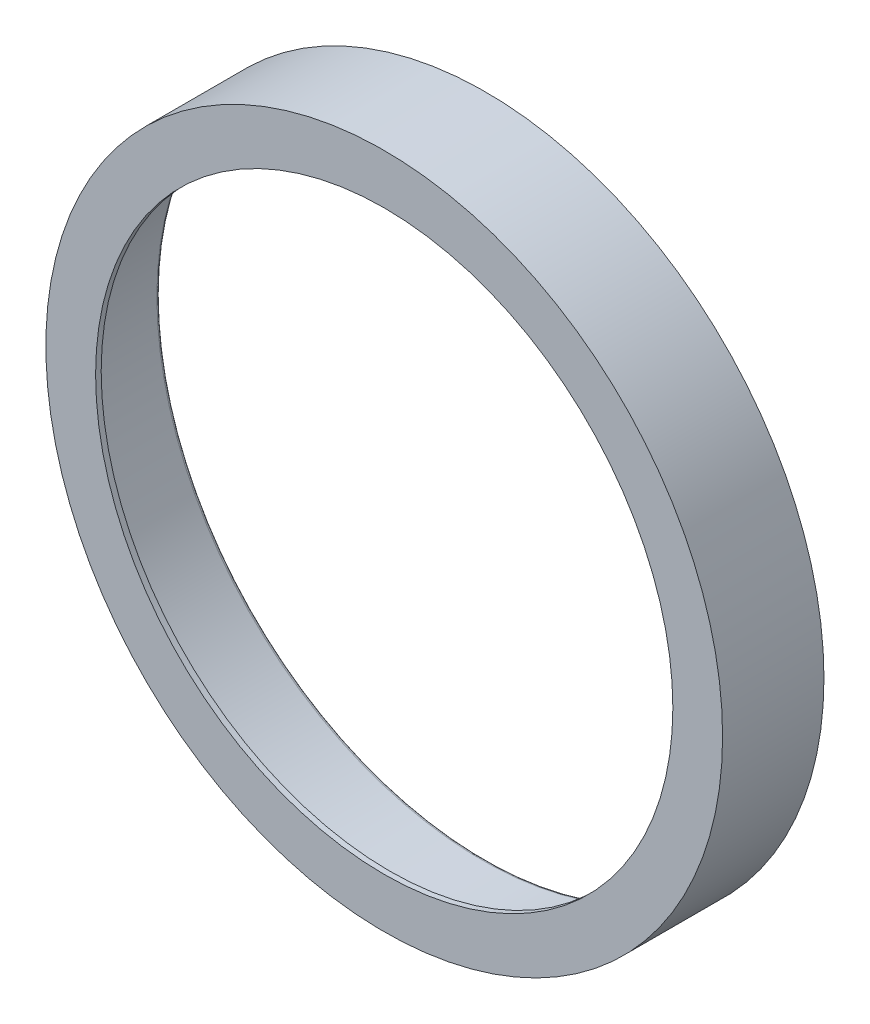
ISO-10303-21;
HEADER;
FILE_DESCRIPTION(('STEP AP214'),'2;1');
FILE_NAME('part.step','',(''),(''),'','','');
FILE_SCHEMA(('AUTOMOTIVE_DESIGN { 1 0 10303 214 1 1 1 1 }'));
ENDSEC;
DATA;
#1=APPLICATION_CONTEXT('core data for automotive mechanical design processes');
#2=APPLICATION_PROTOCOL_DEFINITION('international standard','automotive_design',2000,#1);
#3=PRODUCT_CONTEXT('',#1,'mechanical');
#4=PRODUCT('Part','Part','',(#3));
#5=PRODUCT_RELATED_PRODUCT_CATEGORY('part','',(#4));
#6=PRODUCT_DEFINITION_FORMATION('','',#4);
#7=PRODUCT_DEFINITION_CONTEXT('part definition',#1,'design');
#8=PRODUCT_DEFINITION('design','',#6,#7);
#9=PRODUCT_DEFINITION_SHAPE('','',#8);
#10=(LENGTH_UNIT() NAMED_UNIT(*) SI_UNIT(.MILLI.,.METRE.));
#11=(NAMED_UNIT(*) PLANE_ANGLE_UNIT() SI_UNIT($,.RADIAN.));
#12=(NAMED_UNIT(*) SI_UNIT($,.STERADIAN.) SOLID_ANGLE_UNIT());
#13=UNCERTAINTY_MEASURE_WITH_UNIT(LENGTH_MEASURE(1.E-05),#10,'distance_accuracy_value','');
#14=(GEOMETRIC_REPRESENTATION_CONTEXT(3) GLOBAL_UNCERTAINTY_ASSIGNED_CONTEXT((#13)) GLOBAL_UNIT_ASSIGNED_CONTEXT((#10,
#11,#12)) REPRESENTATION_CONTEXT('',''));
#15=CARTESIAN_POINT('',(0.,0.,0.));
#16=DIRECTION('',(0.,0.,1.));
#17=DIRECTION('',(1.,0.,0.));
#18=AXIS2_PLACEMENT_3D('',#15,#16,#17);
#19=CARTESIAN_POINT('',(0.,0.,31.75));
#20=DIRECTION('',(0.,0.,-1.));
#21=DIRECTION('',(-1.,0.,0.));
#22=AXIS2_PLACEMENT_3D('',#19,#20,#21);
#23=CYLINDRICAL_SURFACE('',#22,90.4143496384652);
#24=CARTESIAN_POINT('',(0.,0.,31.75));
#25=DIRECTION('',(0.,0.,1.));
#26=DIRECTION('',(1.,0.,0.));
#27=AXIS2_PLACEMENT_3D('',#24,#25,#26);
#28=CIRCLE('',#27,90.4143496384652);
#29=CARTESIAN_POINT('',(90.4143496384652,0.,31.75));
#30=VERTEX_POINT('',#29);
#31=EDGE_CURVE('E72',#30,#30,#28,.T.);
#32=ORIENTED_EDGE('',*,*,#31,.T.);
#33=EDGE_LOOP('',(#32));
#34=FACE_BOUND('',#33,.T.);
#35=CARTESIAN_POINT('',(0.,0.,30.));
#36=DIRECTION('',(0.,0.,-1.));
#37=DIRECTION('',(-1.,0.,0.));
#38=AXIS2_PLACEMENT_3D('',#35,#36,#37);
#39=CIRCLE('',#38,90.4143496384652);
#40=CARTESIAN_POINT('',(-90.4143496384652,0.,30.));
#41=VERTEX_POINT('',#40);
#42=EDGE_CURVE('E68',#41,#41,#39,.T.);
#43=ORIENTED_EDGE('',*,*,#42,.T.);
#44=EDGE_LOOP('',(#43));
#45=FACE_BOUND('',#44,.T.);
#46=ADVANCED_FACE('F43',(#34,#45),#23,.F.);
#47=CARTESIAN_POINT('',(0.,0.,31.75));
#48=DIRECTION('',(0.,0.,1.));
#49=DIRECTION('',(1.,0.,0.));
#50=AXIS2_PLACEMENT_3D('',#47,#48,#49);
#51=PLANE('',#50);
#52=CARTESIAN_POINT('',(0.,0.,31.75));
#53=DIRECTION('',(0.,0.,1.));
#54=DIRECTION('',(1.,0.,0.));
#55=AXIS2_PLACEMENT_3D('',#52,#53,#54);
#56=CIRCLE('',#55,106.);
#57=CARTESIAN_POINT('',(106.,0.,31.75));
#58=VERTEX_POINT('',#57);
#59=EDGE_CURVE('E67',#58,#58,#56,.T.);
#60=ORIENTED_EDGE('',*,*,#59,.T.);
#61=EDGE_LOOP('',(#60));
#62=FACE_BOUND('',#61,.T.);
#63=ORIENTED_EDGE('',*,*,#31,.F.);
#64=EDGE_LOOP('',(#63));
#65=FACE_BOUND('',#64,.T.);
#66=ADVANCED_FACE('F86',(#62,#65),#51,.T.);
#67=CARTESIAN_POINT('',(0.,0.,0.));
#68=DIRECTION('',(0.,0.,1.));
#69=DIRECTION('',(1.,0.,0.));
#70=AXIS2_PLACEMENT_3D('',#67,#68,#69);
#71=PLANE('',#70);
#72=CARTESIAN_POINT('',(0.,0.,0.));
#73=DIRECTION('',(0.,0.,1.));
#74=DIRECTION('',(1.,0.,0.));
#75=AXIS2_PLACEMENT_3D('',#72,#73,#74);
#76=CIRCLE('',#75,102.971973165909);
#77=CARTESIAN_POINT('',(102.971973165909,0.,0.));
#78=VERTEX_POINT('',#77);
#79=EDGE_CURVE('E56',#78,#78,#76,.T.);
#80=ORIENTED_EDGE('',*,*,#79,.T.);
#81=EDGE_LOOP('',(#80));
#82=FACE_BOUND('',#81,.T.);
#83=CARTESIAN_POINT('',(0.,0.,0.));
#84=DIRECTION('',(0.,0.,1.));
#85=DIRECTION('',(1.,0.,0.));
#86=AXIS2_PLACEMENT_3D('',#83,#84,#85);
#87=CIRCLE('',#86,106.);
#88=CARTESIAN_POINT('',(106.,0.,0.));
#89=VERTEX_POINT('',#88);
#90=EDGE_CURVE('E73',#89,#89,#87,.T.);
#91=ORIENTED_EDGE('',*,*,#90,.F.);
#92=EDGE_LOOP('',(#91));
#93=FACE_BOUND('',#92,.T.);
#94=ADVANCED_FACE('F88',(#82,#93),#71,.F.);
#95=CARTESIAN_POINT('',(0.,0.,31.75));
#96=DIRECTION('',(0.,0.,-1.));
#97=DIRECTION('',(-1.,0.,0.));
#98=AXIS2_PLACEMENT_3D('',#95,#96,#97);
#99=CYLINDRICAL_SURFACE('',#98,106.);
#100=ORIENTED_EDGE('',*,*,#59,.F.);
#101=EDGE_LOOP('',(#100));
#102=FACE_BOUND('',#101,.T.);
#103=ORIENTED_EDGE('',*,*,#90,.T.);
#104=EDGE_LOOP('',(#103));
#105=FACE_BOUND('',#104,.T.);
#106=ADVANCED_FACE('F95',(#102,#105),#99,.T.);
#107=CARTESIAN_POINT('',(0.,0.,30.));
#108=DIRECTION('',(0.,0.,-1.));
#109=DIRECTION('',(-1.,0.,0.));
#110=AXIS2_PLACEMENT_3D('',#107,#108,#109);
#111=CYLINDRICAL_SURFACE('',#110,101.971973165909);
#112=CARTESIAN_POINT('',(0.,0.,29.));
#113=DIRECTION('',(0.,0.,-1.));
#114=DIRECTION('',(-1.,0.,0.));
#115=AXIS2_PLACEMENT_3D('',#112,#113,#114);
#116=CIRCLE('',#115,101.971973165909);
#117=CARTESIAN_POINT('',(-101.971973165909,0.,29.));
#118=VERTEX_POINT('',#117);
#119=EDGE_CURVE('E10',#118,#118,#116,.F.);
#120=ORIENTED_EDGE('',*,*,#119,.T.);
#121=EDGE_LOOP('',(#120));
#122=FACE_BOUND('',#121,.T.);
#123=CARTESIAN_POINT('',(0.,0.,1.));
#124=DIRECTION('',(0.,0.,1.));
#125=DIRECTION('',(1.,0.,0.));
#126=AXIS2_PLACEMENT_3D('',#123,#124,#125);
#127=CIRCLE('',#126,101.971973165909);
#128=CARTESIAN_POINT('',(101.971973165909,0.,1.));
#129=VERTEX_POINT('',#128);
#130=EDGE_CURVE('E61',#129,#129,#127,.F.);
#131=ORIENTED_EDGE('',*,*,#130,.T.);
#132=EDGE_LOOP('',(#131));
#133=FACE_BOUND('',#132,.T.);
#134=ADVANCED_FACE('F102',(#122,#133),#111,.F.);
#135=CARTESIAN_POINT('',(0.,0.,30.));
#136=DIRECTION('',(0.,0.,-1.));
#137=DIRECTION('',(-1.,0.,0.));
#138=AXIS2_PLACEMENT_3D('',#135,#136,#137);
#139=PLANE('',#138);
#140=CARTESIAN_POINT('',(0.,0.,30.));
#141=DIRECTION('',(0.,0.,-1.));
#142=DIRECTION('',(-1.,0.,0.));
#143=AXIS2_PLACEMENT_3D('',#140,#141,#142);
#144=CIRCLE('',#143,100.971973165909);
#145=CARTESIAN_POINT('',(-100.971973165909,0.,30.));
#146=VERTEX_POINT('',#145);
#147=EDGE_CURVE('E51',#146,#146,#144,.T.);
#148=ORIENTED_EDGE('',*,*,#147,.T.);
#149=EDGE_LOOP('',(#148));
#150=FACE_BOUND('',#149,.T.);
#151=ORIENTED_EDGE('',*,*,#42,.F.);
#152=EDGE_LOOP('',(#151));
#153=FACE_BOUND('',#152,.T.);
#154=ADVANCED_FACE('F106',(#150,#153),#139,.T.);
#155=CARTESIAN_POINT('',(0.,0.,1.));
#156=DIRECTION('',(0.,0.,1.));
#157=DIRECTION('',(1.,0.,0.));
#158=AXIS2_PLACEMENT_3D('',#155,#156,#157);
#159=TOROIDAL_SURFACE('',#158,102.971973165909,1.);
#160=ORIENTED_EDGE('',*,*,#79,.F.);
#161=EDGE_LOOP('',(#160));
#162=FACE_BOUND('',#161,.T.);
#163=ORIENTED_EDGE('',*,*,#130,.F.);
#164=EDGE_LOOP('',(#163));
#165=FACE_BOUND('',#164,.T.);
#166=ADVANCED_FACE('F104',(#162,#165),#159,.T.);
#167=CARTESIAN_POINT('',(0.,0.,29.));
#168=DIRECTION('',(0.,0.,-1.));
#169=DIRECTION('',(-1.,0.,0.));
#170=AXIS2_PLACEMENT_3D('',#167,#168,#169);
#171=TOROIDAL_SURFACE('',#170,100.971973165909,1.);
#172=ORIENTED_EDGE('',*,*,#119,.F.);
#173=EDGE_LOOP('',(#172));
#174=FACE_BOUND('',#173,.T.);
#175=ORIENTED_EDGE('',*,*,#147,.F.);
#176=EDGE_LOOP('',(#175));
#177=FACE_BOUND('',#176,.T.);
#178=ADVANCED_FACE('F45',(#174,#177),#171,.F.);
#179=CLOSED_SHELL('',(#46,#66,#94,#106,#134,#154,#166,#178));
#180=MANIFOLD_SOLID_BREP('B2',#179);
#181=ADVANCED_BREP_SHAPE_REPRESENTATION('',(#18,#180),#14);
#182=SHAPE_DEFINITION_REPRESENTATION(#9,#181);
ENDSEC;
END-ISO-10303-21;
